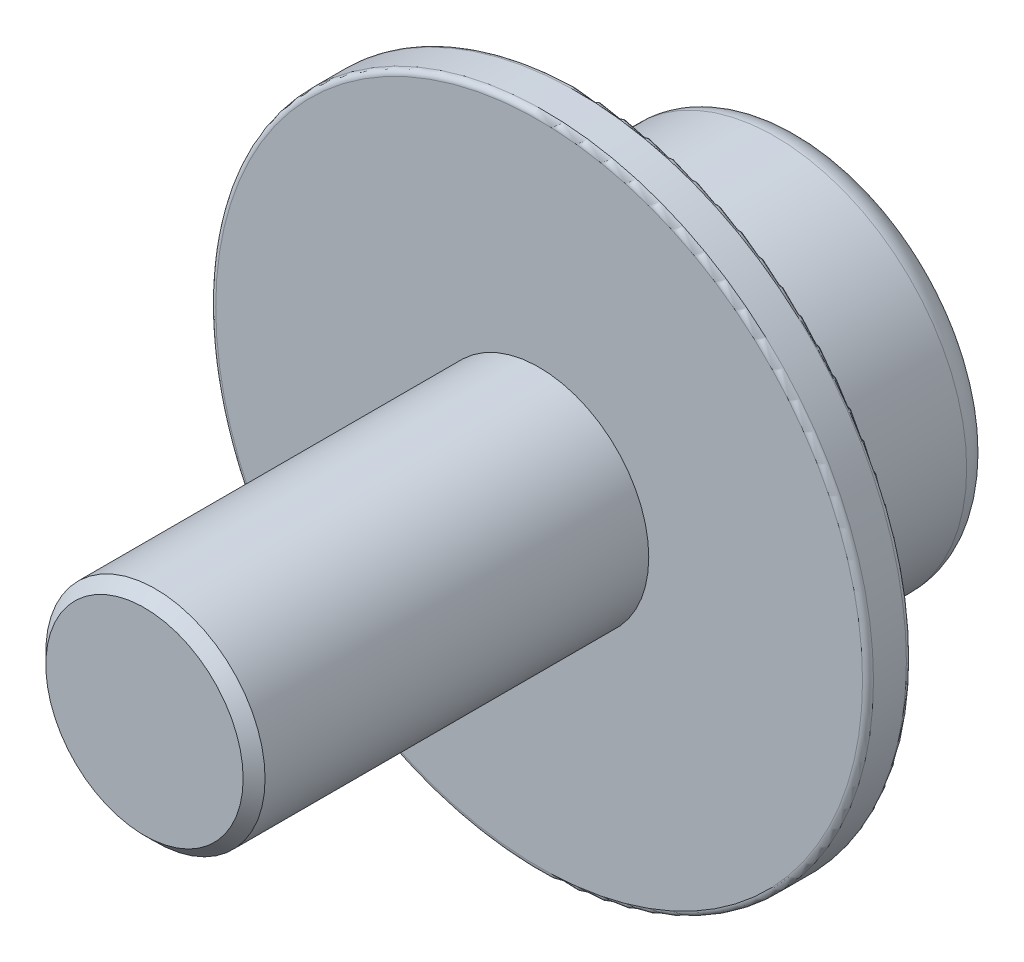
ISO-10303-21;
HEADER;
FILE_DESCRIPTION(('STEP AP214'),'2;1');
FILE_NAME('part.step','',(''),(''),'','','');
FILE_SCHEMA(('AUTOMOTIVE_DESIGN { 1 0 10303 214 1 1 1 1 }'));
ENDSEC;
DATA;
#1=APPLICATION_CONTEXT('core data for automotive mechanical design processes');
#2=APPLICATION_PROTOCOL_DEFINITION('international standard','automotive_design',2000,#1);
#3=PRODUCT_CONTEXT('',#1,'mechanical');
#4=PRODUCT('Part','Part','',(#3));
#5=PRODUCT_RELATED_PRODUCT_CATEGORY('part','',(#4));
#6=PRODUCT_DEFINITION_FORMATION('','',#4);
#7=PRODUCT_DEFINITION_CONTEXT('part definition',#1,'design');
#8=PRODUCT_DEFINITION('design','',#6,#7);
#9=PRODUCT_DEFINITION_SHAPE('','',#8);
#10=(LENGTH_UNIT() NAMED_UNIT(*) SI_UNIT(.MILLI.,.METRE.));
#11=(NAMED_UNIT(*) PLANE_ANGLE_UNIT() SI_UNIT($,.RADIAN.));
#12=(NAMED_UNIT(*) SI_UNIT($,.STERADIAN.) SOLID_ANGLE_UNIT());
#13=UNCERTAINTY_MEASURE_WITH_UNIT(LENGTH_MEASURE(1.E-05),#10,'distance_accuracy_value','');
#14=(GEOMETRIC_REPRESENTATION_CONTEXT(3) GLOBAL_UNCERTAINTY_ASSIGNED_CONTEXT((#13)) GLOBAL_UNIT_ASSIGNED_CONTEXT((#10,
#11,#12)) REPRESENTATION_CONTEXT('',''));
#15=CARTESIAN_POINT('',(0.,0.,0.));
#16=DIRECTION('',(0.,0.,1.));
#17=DIRECTION('',(1.,0.,0.));
#18=AXIS2_PLACEMENT_3D('',#15,#16,#17);
#19=CARTESIAN_POINT('',(0.,0.,4.));
#20=DIRECTION('',(0.,0.,-1.));
#21=DIRECTION('',(-1.,0.,0.));
#22=AXIS2_PLACEMENT_3D('',#19,#20,#21);
#23=CYLINDRICAL_SURFACE('',#22,3.5);
#24=CARTESIAN_POINT('',(0.,0.,3.5));
#25=DIRECTION('',(0.,0.,1.));
#26=DIRECTION('',(1.,0.,0.));
#27=AXIS2_PLACEMENT_3D('',#24,#25,#26);
#28=CIRCLE('',#27,3.5);
#29=CARTESIAN_POINT('',(3.5,0.,3.5));
#30=VERTEX_POINT('',#29);
#31=EDGE_CURVE('E180',#30,#30,#28,.F.);
#32=ORIENTED_EDGE('',*,*,#31,.T.);
#33=EDGE_LOOP('',(#32));
#34=FACE_BOUND('',#33,.T.);
#35=CARTESIAN_POINT('',(0.,0.,0.5));
#36=DIRECTION('',(0.,0.,1.));
#37=DIRECTION('',(1.,0.,0.));
#38=AXIS2_PLACEMENT_3D('',#35,#36,#37);
#39=CIRCLE('',#38,3.5);
#40=CARTESIAN_POINT('',(3.5,0.,0.5));
#41=VERTEX_POINT('',#40);
#42=EDGE_CURVE('E176',#41,#41,#39,.T.);
#43=ORIENTED_EDGE('',*,*,#42,.T.);
#44=EDGE_LOOP('',(#43));
#45=FACE_BOUND('',#44,.T.);
#46=ADVANCED_FACE('F41',(#34,#45),#23,.T.);
#47=CARTESIAN_POINT('',(0.,0.,0.));
#48=DIRECTION('',(0.,0.,1.));
#49=DIRECTION('',(1.,0.,0.));
#50=AXIS2_PLACEMENT_3D('',#47,#48,#49);
#51=PLANE('',#50);
#52=CARTESIAN_POINT('',(0.,0.,0.));
#53=DIRECTION('',(0.,0.,1.));
#54=DIRECTION('',(1.,0.,0.));
#55=AXIS2_PLACEMENT_3D('',#52,#53,#54);
#56=CIRCLE('',#55,3.);
#57=CARTESIAN_POINT('',(3.,0.,0.));
#58=VERTEX_POINT('',#57);
#59=EDGE_CURVE('E203',#58,#58,#56,.F.);
#60=ORIENTED_EDGE('',*,*,#59,.T.);
#61=EDGE_LOOP('',(#60));
#62=FACE_BOUND('',#61,.T.);
#63=DIRECTION('',(0.5,-0.866025403784439,0.));
#64=VECTOR('',#63,1.);
#65=CARTESIAN_POINT('',(1.94855715851499,1.125,0.));
#66=LINE('',#65,#64);
#67=CARTESIAN_POINT('',(2.59807621135332,0.,0.));
#68=VERTEX_POINT('',#67);
#69=CARTESIAN_POINT('',(1.29903810567666,2.25,0.));
#70=VERTEX_POINT('',#69);
#71=EDGE_CURVE('E196',#68,#70,#66,.F.);
#72=ORIENTED_EDGE('',*,*,#71,.T.);
#73=DIRECTION('',(1.,0.,0.));
#74=VECTOR('',#73,1.);
#75=CARTESIAN_POINT('',(0.,2.25,0.));
#76=LINE('',#75,#74);
#77=CARTESIAN_POINT('',(-1.29903810567666,2.25,0.));
#78=VERTEX_POINT('',#77);
#79=EDGE_CURVE('E199',#70,#78,#76,.F.);
#80=ORIENTED_EDGE('',*,*,#79,.T.);
#81=DIRECTION('',(0.5,0.866025403784439,0.));
#82=VECTOR('',#81,1.);
#83=CARTESIAN_POINT('',(-1.94855715851499,1.125,0.));
#84=LINE('',#83,#82);
#85=CARTESIAN_POINT('',(-2.59807621135332,0.,0.));
#86=VERTEX_POINT('',#85);
#87=EDGE_CURVE('E184',#78,#86,#84,.F.);
#88=ORIENTED_EDGE('',*,*,#87,.T.);
#89=DIRECTION('',(-0.5,0.866025403784439,0.));
#90=VECTOR('',#89,1.);
#91=CARTESIAN_POINT('',(-1.94855715851499,-1.125,0.));
#92=LINE('',#91,#90);
#93=CARTESIAN_POINT('',(-1.29903810567666,-2.25,0.));
#94=VERTEX_POINT('',#93);
#95=EDGE_CURVE('E187',#86,#94,#92,.F.);
#96=ORIENTED_EDGE('',*,*,#95,.T.);
#97=DIRECTION('',(-1.,0.,0.));
#98=VECTOR('',#97,1.);
#99=CARTESIAN_POINT('',(0.,-2.25,0.));
#100=LINE('',#99,#98);
#101=CARTESIAN_POINT('',(1.29903810567666,-2.25,0.));
#102=VERTEX_POINT('',#101);
#103=EDGE_CURVE('E190',#94,#102,#100,.F.);
#104=ORIENTED_EDGE('',*,*,#103,.T.);
#105=DIRECTION('',(-0.5,-0.866025403784439,0.));
#106=VECTOR('',#105,1.);
#107=CARTESIAN_POINT('',(1.94855715851499,-1.125,0.));
#108=LINE('',#107,#106);
#109=EDGE_CURVE('E193',#102,#68,#108,.F.);
#110=ORIENTED_EDGE('',*,*,#109,.T.);
#111=EDGE_LOOP('',(#72,#80,#88,#96,#104,#110));
#112=FACE_BOUND('',#111,.T.);
#113=ADVANCED_FACE('F301',(#62,#112),#51,.F.);
#114=CARTESIAN_POINT('',(-1.01036297108185,-1.75,2.5));
#115=DIRECTION('',(-0.866025403784439,-0.5,0.));
#116=DIRECTION('',(0.5,-0.866025403784439,0.));
#117=AXIS2_PLACEMENT_3D('',#114,#115,#116);
#118=PLANE('',#117);
#119=DIRECTION('',(0.,0.,-1.));
#120=VECTOR('',#119,1.);
#121=CARTESIAN_POINT('',(-1.01036297108185,-1.75,2.5));
#122=LINE('',#121,#120);
#123=CARTESIAN_POINT('',(-1.01036297108185,-1.75,2.5));
#124=VERTEX_POINT('',#123);
#125=CARTESIAN_POINT('',(-1.01036297108185,-1.75,0.5));
#126=VERTEX_POINT('',#125);
#127=EDGE_CURVE('E156',#124,#126,#122,.T.);
#128=ORIENTED_EDGE('',*,*,#127,.T.);
#129=DIRECTION('',(-0.5,0.866025403784439,0.));
#130=VECTOR('',#129,1.);
#131=CARTESIAN_POINT('',(-1.01036297108185,-1.75,0.5));
#132=LINE('',#131,#130);
#133=CARTESIAN_POINT('',(-2.02072594216369,0.,0.5));
#134=VERTEX_POINT('',#133);
#135=EDGE_CURVE('E57',#126,#134,#132,.T.);
#136=ORIENTED_EDGE('',*,*,#135,.T.);
#137=DIRECTION('',(0.,0.,-1.));
#138=VECTOR('',#137,1.);
#139=CARTESIAN_POINT('',(-2.02072594216369,0.,2.5));
#140=LINE('',#139,#138);
#141=CARTESIAN_POINT('',(-2.02072594216369,0.,2.5));
#142=VERTEX_POINT('',#141);
#143=EDGE_CURVE('E112',#142,#134,#140,.T.);
#144=ORIENTED_EDGE('',*,*,#143,.F.);
#145=DIRECTION('',(-0.5,0.866025403784439,0.));
#146=VECTOR('',#145,1.);
#147=CARTESIAN_POINT('',(-1.01036297108185,-1.75,2.5));
#148=LINE('',#147,#146);
#149=EDGE_CURVE('E116',#124,#142,#148,.T.);
#150=ORIENTED_EDGE('',*,*,#149,.F.);
#151=EDGE_LOOP('',(#128,#136,#144,#150));
#152=FACE_BOUND('',#151,.T.);
#153=ADVANCED_FACE('F114',(#152),#118,.F.);
#154=CARTESIAN_POINT('',(1.01036297108185,-1.75,2.5));
#155=DIRECTION('',(0.,-1.,0.));
#156=DIRECTION('',(0.,0.,-1.));
#157=AXIS2_PLACEMENT_3D('',#154,#155,#156);
#158=PLANE('',#157);
#159=DIRECTION('',(0.,0.,-1.));
#160=VECTOR('',#159,1.);
#161=CARTESIAN_POINT('',(1.01036297108185,-1.75,2.5));
#162=LINE('',#161,#160);
#163=CARTESIAN_POINT('',(1.01036297108185,-1.75,2.5));
#164=VERTEX_POINT('',#163);
#165=CARTESIAN_POINT('',(1.01036297108185,-1.75,0.5));
#166=VERTEX_POINT('',#165);
#167=EDGE_CURVE('E160',#164,#166,#162,.T.);
#168=ORIENTED_EDGE('',*,*,#167,.T.);
#169=DIRECTION('',(-1.,0.,0.));
#170=VECTOR('',#169,1.);
#171=CARTESIAN_POINT('',(1.01036297108185,-1.75,0.5));
#172=LINE('',#171,#170);
#173=EDGE_CURVE('E65',#166,#126,#172,.T.);
#174=ORIENTED_EDGE('',*,*,#173,.T.);
#175=ORIENTED_EDGE('',*,*,#127,.F.);
#176=DIRECTION('',(-1.,0.,0.));
#177=VECTOR('',#176,1.);
#178=CARTESIAN_POINT('',(1.01036297108185,-1.75,2.5));
#179=LINE('',#178,#177);
#180=EDGE_CURVE('E122',#164,#124,#179,.T.);
#181=ORIENTED_EDGE('',*,*,#180,.F.);
#182=EDGE_LOOP('',(#168,#174,#175,#181));
#183=FACE_BOUND('',#182,.T.);
#184=ADVANCED_FACE('F370',(#183),#158,.F.);
#185=CARTESIAN_POINT('',(2.02072594216369,0.,2.5));
#186=DIRECTION('',(0.866025403784439,-0.5,0.));
#187=DIRECTION('',(0.5,0.866025403784439,0.));
#188=AXIS2_PLACEMENT_3D('',#185,#186,#187);
#189=PLANE('',#188);
#190=DIRECTION('',(0.,0.,-1.));
#191=VECTOR('',#190,1.);
#192=CARTESIAN_POINT('',(2.02072594216369,0.,2.5));
#193=LINE('',#192,#191);
#194=CARTESIAN_POINT('',(2.02072594216369,0.,2.5));
#195=VERTEX_POINT('',#194);
#196=CARTESIAN_POINT('',(2.02072594216369,0.,0.5));
#197=VERTEX_POINT('',#196);
#198=EDGE_CURVE('E163',#195,#197,#193,.T.);
#199=ORIENTED_EDGE('',*,*,#198,.T.);
#200=DIRECTION('',(-0.5,-0.866025403784439,0.));
#201=VECTOR('',#200,1.);
#202=CARTESIAN_POINT('',(2.02072594216369,0.,0.5));
#203=LINE('',#202,#201);
#204=EDGE_CURVE('E214',#197,#166,#203,.T.);
#205=ORIENTED_EDGE('',*,*,#204,.T.);
#206=ORIENTED_EDGE('',*,*,#167,.F.);
#207=DIRECTION('',(-0.5,-0.866025403784439,0.));
#208=VECTOR('',#207,1.);
#209=CARTESIAN_POINT('',(2.02072594216369,0.,2.5));
#210=LINE('',#209,#208);
#211=EDGE_CURVE('E151',#195,#164,#210,.T.);
#212=ORIENTED_EDGE('',*,*,#211,.F.);
#213=EDGE_LOOP('',(#199,#205,#206,#212));
#214=FACE_BOUND('',#213,.T.);
#215=ADVANCED_FACE('F369',(#214),#189,.F.);
#216=CARTESIAN_POINT('',(1.01036297108185,1.75,2.5));
#217=DIRECTION('',(0.866025403784439,0.5,0.));
#218=DIRECTION('',(-0.5,0.866025403784439,0.));
#219=AXIS2_PLACEMENT_3D('',#216,#217,#218);
#220=PLANE('',#219);
#221=DIRECTION('',(0.,0.,-1.));
#222=VECTOR('',#221,1.);
#223=CARTESIAN_POINT('',(1.01036297108185,1.75,2.5));
#224=LINE('',#223,#222);
#225=CARTESIAN_POINT('',(1.01036297108185,1.75,2.5));
#226=VERTEX_POINT('',#225);
#227=CARTESIAN_POINT('',(1.01036297108185,1.75,0.5));
#228=VERTEX_POINT('',#227);
#229=EDGE_CURVE('E167',#226,#228,#224,.T.);
#230=ORIENTED_EDGE('',*,*,#229,.T.);
#231=DIRECTION('',(0.5,-0.866025403784439,0.));
#232=VECTOR('',#231,1.);
#233=CARTESIAN_POINT('',(1.01036297108185,1.75,0.5));
#234=LINE('',#233,#232);
#235=EDGE_CURVE('E211',#228,#197,#234,.T.);
#236=ORIENTED_EDGE('',*,*,#235,.T.);
#237=ORIENTED_EDGE('',*,*,#198,.F.);
#238=DIRECTION('',(0.5,-0.866025403784439,0.));
#239=VECTOR('',#238,1.);
#240=CARTESIAN_POINT('',(1.01036297108185,1.75,2.5));
#241=LINE('',#240,#239);
#242=EDGE_CURVE('E147',#226,#195,#241,.T.);
#243=ORIENTED_EDGE('',*,*,#242,.F.);
#244=EDGE_LOOP('',(#230,#236,#237,#243));
#245=FACE_BOUND('',#244,.T.);
#246=ADVANCED_FACE('F366',(#245),#220,.F.);
#247=CARTESIAN_POINT('',(-1.01036297108184,1.75,2.5));
#248=DIRECTION('',(0.,1.,0.));
#249=DIRECTION('',(0.,0.,1.));
#250=AXIS2_PLACEMENT_3D('',#247,#248,#249);
#251=PLANE('',#250);
#252=DIRECTION('',(0.,0.,-1.));
#253=VECTOR('',#252,1.);
#254=CARTESIAN_POINT('',(-1.01036297108184,1.75,2.5));
#255=LINE('',#254,#253);
#256=CARTESIAN_POINT('',(-1.01036297108184,1.75,2.5));
#257=VERTEX_POINT('',#256);
#258=CARTESIAN_POINT('',(-1.01036297108184,1.75,0.5));
#259=VERTEX_POINT('',#258);
#260=EDGE_CURVE('E121',#257,#259,#255,.T.);
#261=ORIENTED_EDGE('',*,*,#260,.T.);
#262=DIRECTION('',(1.,0.,0.));
#263=VECTOR('',#262,1.);
#264=CARTESIAN_POINT('',(-1.01036297108184,1.75,0.5));
#265=LINE('',#264,#263);
#266=EDGE_CURVE('E207',#259,#228,#265,.T.);
#267=ORIENTED_EDGE('',*,*,#266,.T.);
#268=ORIENTED_EDGE('',*,*,#229,.F.);
#269=DIRECTION('',(1.,0.,0.));
#270=VECTOR('',#269,1.);
#271=CARTESIAN_POINT('',(-1.01036297108184,1.75,2.5));
#272=LINE('',#271,#270);
#273=EDGE_CURVE('E132',#257,#226,#272,.T.);
#274=ORIENTED_EDGE('',*,*,#273,.F.);
#275=EDGE_LOOP('',(#261,#267,#268,#274));
#276=FACE_BOUND('',#275,.T.);
#277=ADVANCED_FACE('F362',(#276),#251,.F.);
#278=CARTESIAN_POINT('',(-2.02072594216369,0.,2.5));
#279=DIRECTION('',(-0.866025403784439,0.5,0.));
#280=DIRECTION('',(-0.5,-0.866025403784439,0.));
#281=AXIS2_PLACEMENT_3D('',#278,#279,#280);
#282=PLANE('',#281);
#283=ORIENTED_EDGE('',*,*,#143,.T.);
#284=DIRECTION('',(0.5,0.866025403784439,0.));
#285=VECTOR('',#284,1.);
#286=CARTESIAN_POINT('',(-2.02072594216369,0.,0.5));
#287=LINE('',#286,#285);
#288=EDGE_CURVE('E221',#134,#259,#287,.T.);
#289=ORIENTED_EDGE('',*,*,#288,.T.);
#290=ORIENTED_EDGE('',*,*,#260,.F.);
#291=DIRECTION('',(0.5,0.866025403784439,0.));
#292=VECTOR('',#291,1.);
#293=CARTESIAN_POINT('',(-2.02072594216369,0.,2.5));
#294=LINE('',#293,#292);
#295=EDGE_CURVE('E125',#142,#257,#294,.T.);
#296=ORIENTED_EDGE('',*,*,#295,.F.);
#297=EDGE_LOOP('',(#283,#289,#290,#296));
#298=FACE_BOUND('',#297,.T.);
#299=ADVANCED_FACE('F126',(#298),#282,.F.);
#300=CARTESIAN_POINT('',(0.,0.,2.5));
#301=DIRECTION('',(0.,0.,-1.));
#302=DIRECTION('',(-1.,0.,0.));
#303=AXIS2_PLACEMENT_3D('',#300,#301,#302);
#304=PLANE('',#303);
#305=ORIENTED_EDGE('',*,*,#149,.T.);
#306=ORIENTED_EDGE('',*,*,#295,.T.);
#307=ORIENTED_EDGE('',*,*,#273,.T.);
#308=ORIENTED_EDGE('',*,*,#242,.T.);
#309=ORIENTED_EDGE('',*,*,#211,.T.);
#310=ORIENTED_EDGE('',*,*,#180,.T.);
#311=EDGE_LOOP('',(#305,#306,#307,#308,#309,#310));
#312=FACE_BOUND('',#311,.T.);
#313=ADVANCED_FACE('F134',(#312),#304,.T.);
#314=CARTESIAN_POINT('',(0.,0.,3.5));
#315=DIRECTION('',(0.,0.,1.));
#316=DIRECTION('',(1.,0.,0.));
#317=AXIS2_PLACEMENT_3D('',#314,#315,#316);
#318=TOROIDAL_SURFACE('',#317,3.,0.5);
#319=ORIENTED_EDGE('',*,*,#31,.F.);
#320=EDGE_LOOP('',(#319));
#321=FACE_BOUND('',#320,.T.);
#322=CARTESIAN_POINT('',(0.,0.,4.));
#323=DIRECTION('',(0.,0.,1.));
#324=DIRECTION('',(1.,0.,0.));
#325=AXIS2_PLACEMENT_3D('',#322,#323,#324);
#326=CIRCLE('',#325,3.);
#327=CARTESIAN_POINT('',(3.,0.,4.));
#328=VERTEX_POINT('',#327);
#329=EDGE_CURVE('E159',#328,#328,#326,.T.);
#330=ORIENTED_EDGE('',*,*,#329,.F.);
#331=EDGE_LOOP('',(#330));
#332=FACE_BOUND('',#331,.T.);
#333=ADVANCED_FACE('F311',(#321,#332),#318,.T.);
#334=CARTESIAN_POINT('',(0.,0.,0.5));
#335=DIRECTION('',(0.,0.,1.));
#336=DIRECTION('',(1.,0.,0.));
#337=AXIS2_PLACEMENT_3D('',#334,#335,#336);
#338=TOROIDAL_SURFACE('',#337,3.,0.5);
#339=ORIENTED_EDGE('',*,*,#59,.F.);
#340=EDGE_LOOP('',(#339));
#341=FACE_BOUND('',#340,.T.);
#342=ORIENTED_EDGE('',*,*,#42,.F.);
#343=EDGE_LOOP('',(#342));
#344=FACE_BOUND('',#343,.T.);
#345=ADVANCED_FACE('F314',(#341,#344),#338,.T.);
#346=CARTESIAN_POINT('',(1.01036297108185,-2.25,0.5));
#347=DIRECTION('',(-1.,0.,0.));
#348=DIRECTION('',(0.,0.,1.));
#349=AXIS2_PLACEMENT_3D('',#346,#347,#348);
#350=CYLINDRICAL_SURFACE('',#349,0.5);
#351=CARTESIAN_POINT('',(1.29903810567666,-2.25,0.5));
#352=DIRECTION('',(-0.866025403784439,-0.5,0.));
#353=DIRECTION('',(0.5,-0.866025403784439,0.));
#354=AXIS2_PLACEMENT_3D('',#351,#352,#353);
#355=ELLIPSE('',#354,0.577350269189626,0.5);
#356=EDGE_CURVE('E142',#102,#166,#355,.F.);
#357=ORIENTED_EDGE('',*,*,#356,.F.);
#358=ORIENTED_EDGE('',*,*,#103,.F.);
#359=CARTESIAN_POINT('',(-1.29903810567666,-2.25,0.5));
#360=DIRECTION('',(-0.866025403784438,0.5,0.));
#361=DIRECTION('',(-0.5,-0.866025403784439,0.));
#362=AXIS2_PLACEMENT_3D('',#359,#360,#361);
#363=ELLIPSE('',#362,0.577350269189626,0.5);
#364=EDGE_CURVE('E138',#126,#94,#363,.T.);
#365=ORIENTED_EDGE('',*,*,#364,.F.);
#366=ORIENTED_EDGE('',*,*,#173,.F.);
#367=EDGE_LOOP('',(#357,#358,#365,#366));
#368=FACE_BOUND('',#367,.T.);
#369=ADVANCED_FACE('F318',(#368),#350,.T.);
#370=CARTESIAN_POINT('',(-1.44337567297406,-2.,0.5));
#371=DIRECTION('',(-0.5,0.866025403784439,0.));
#372=DIRECTION('',(-0.866025403784439,-0.5,0.));
#373=AXIS2_PLACEMENT_3D('',#370,#371,#372);
#374=CYLINDRICAL_SURFACE('',#373,0.5);
#375=ORIENTED_EDGE('',*,*,#364,.T.);
#376=ORIENTED_EDGE('',*,*,#95,.F.);
#377=CARTESIAN_POINT('',(-2.59807621135332,0.,0.5));
#378=DIRECTION('',(0.,1.,0.));
#379=DIRECTION('',(-1.,0.,0.));
#380=AXIS2_PLACEMENT_3D('',#377,#378,#379);
#381=ELLIPSE('',#380,0.577350269189626,0.5);
#382=EDGE_CURVE('E236',#134,#86,#381,.T.);
#383=ORIENTED_EDGE('',*,*,#382,.F.);
#384=ORIENTED_EDGE('',*,*,#135,.F.);
#385=EDGE_LOOP('',(#375,#376,#383,#384));
#386=FACE_BOUND('',#385,.T.);
#387=ADVANCED_FACE('F335',(#386),#374,.T.);
#388=CARTESIAN_POINT('',(2.45373864405591,-0.25,0.5));
#389=DIRECTION('',(-0.5,-0.866025403784439,0.));
#390=DIRECTION('',(0.866025403784439,-0.5,0.));
#391=AXIS2_PLACEMENT_3D('',#388,#389,#390);
#392=CYLINDRICAL_SURFACE('',#391,0.5);
#393=ORIENTED_EDGE('',*,*,#356,.T.);
#394=ORIENTED_EDGE('',*,*,#204,.F.);
#395=CARTESIAN_POINT('',(2.59807621135332,0.,0.5));
#396=DIRECTION('',(0.,-1.,0.));
#397=DIRECTION('',(1.,0.,0.));
#398=AXIS2_PLACEMENT_3D('',#395,#396,#397);
#399=ELLIPSE('',#398,0.577350269189626,0.5);
#400=EDGE_CURVE('E232',#68,#197,#399,.F.);
#401=ORIENTED_EDGE('',*,*,#400,.F.);
#402=ORIENTED_EDGE('',*,*,#109,.F.);
#403=EDGE_LOOP('',(#393,#394,#401,#402));
#404=FACE_BOUND('',#403,.T.);
#405=ADVANCED_FACE('F331',(#404),#392,.T.);
#406=CARTESIAN_POINT('',(-2.45373864405591,0.250000000000001,0.5));
#407=DIRECTION('',(0.5,0.866025403784439,0.));
#408=DIRECTION('',(-0.866025403784439,0.5,0.));
#409=AXIS2_PLACEMENT_3D('',#406,#407,#408);
#410=CYLINDRICAL_SURFACE('',#409,0.5);
#411=ORIENTED_EDGE('',*,*,#382,.T.);
#412=ORIENTED_EDGE('',*,*,#87,.F.);
#413=CARTESIAN_POINT('',(-1.29903810567666,2.25,0.5));
#414=DIRECTION('',(0.866025403784439,0.5,0.));
#415=DIRECTION('',(0.5,-0.866025403784439,0.));
#416=AXIS2_PLACEMENT_3D('',#413,#414,#415);
#417=ELLIPSE('',#416,0.577350269189626,0.5);
#418=EDGE_CURVE('E228',#259,#78,#417,.T.);
#419=ORIENTED_EDGE('',*,*,#418,.F.);
#420=ORIENTED_EDGE('',*,*,#288,.F.);
#421=EDGE_LOOP('',(#411,#412,#419,#420));
#422=FACE_BOUND('',#421,.T.);
#423=ADVANCED_FACE('F327',(#422),#410,.T.);
#424=CARTESIAN_POINT('',(1.44337567297406,2.,0.5));
#425=DIRECTION('',(0.5,-0.866025403784439,0.));
#426=DIRECTION('',(0.866025403784439,0.5,0.));
#427=AXIS2_PLACEMENT_3D('',#424,#425,#426);
#428=CYLINDRICAL_SURFACE('',#427,0.5);
#429=ORIENTED_EDGE('',*,*,#400,.T.);
#430=ORIENTED_EDGE('',*,*,#235,.F.);
#431=CARTESIAN_POINT('',(1.29903810567666,2.25,0.5));
#432=DIRECTION('',(0.866025403784439,-0.5,0.));
#433=DIRECTION('',(0.5,0.866025403784439,0.));
#434=AXIS2_PLACEMENT_3D('',#431,#432,#433);
#435=ELLIPSE('',#434,0.577350269189626,0.5);
#436=EDGE_CURVE('E225',#70,#228,#435,.F.);
#437=ORIENTED_EDGE('',*,*,#436,.F.);
#438=ORIENTED_EDGE('',*,*,#71,.F.);
#439=EDGE_LOOP('',(#429,#430,#437,#438));
#440=FACE_BOUND('',#439,.T.);
#441=ADVANCED_FACE('F323',(#440),#428,.T.);
#442=CARTESIAN_POINT('',(-1.01036297108184,2.25,0.5));
#443=DIRECTION('',(1.,0.,0.));
#444=DIRECTION('',(0.,0.,-1.));
#445=AXIS2_PLACEMENT_3D('',#442,#443,#444);
#446=CYLINDRICAL_SURFACE('',#445,0.5);
#447=ORIENTED_EDGE('',*,*,#418,.T.);
#448=ORIENTED_EDGE('',*,*,#79,.F.);
#449=ORIENTED_EDGE('',*,*,#436,.T.);
#450=ORIENTED_EDGE('',*,*,#266,.F.);
#451=EDGE_LOOP('',(#447,#448,#449,#450));
#452=FACE_BOUND('',#451,.T.);
#453=ADVANCED_FACE('F320',(#452),#446,.T.);
#454=CARTESIAN_POINT('',(0.,0.,4.8));
#455=DIRECTION('',(0.,0.,-1.));
#456=DIRECTION('',(-1.,0.,0.));
#457=AXIS2_PLACEMENT_3D('',#454,#455,#456);
#458=CYLINDRICAL_SURFACE('',#457,6.);
#459=CARTESIAN_POINT('',(0.,0.,4.7));
#460=DIRECTION('',(0.,0.,1.));
#461=DIRECTION('',(1.,0.,0.));
#462=AXIS2_PLACEMENT_3D('',#459,#460,#461);
#463=CIRCLE('',#462,6.);
#464=CARTESIAN_POINT('',(6.,0.,4.7));
#465=VERTEX_POINT('',#464);
#466=EDGE_CURVE('E50',#465,#465,#463,.F.);
#467=ORIENTED_EDGE('',*,*,#466,.T.);
#468=EDGE_LOOP('',(#467));
#469=FACE_BOUND('',#468,.T.);
#470=CARTESIAN_POINT('',(0.,0.,4.1));
#471=DIRECTION('',(0.,0.,1.));
#472=DIRECTION('',(1.,0.,0.));
#473=AXIS2_PLACEMENT_3D('',#470,#471,#472);
#474=CIRCLE('',#473,6.);
#475=CARTESIAN_POINT('',(6.,0.,4.1));
#476=VERTEX_POINT('',#475);
#477=EDGE_CURVE('E257',#476,#476,#474,.T.);
#478=ORIENTED_EDGE('',*,*,#477,.T.);
#479=EDGE_LOOP('',(#478));
#480=FACE_BOUND('',#479,.T.);
#481=ADVANCED_FACE('F264',(#469,#480),#458,.T.);
#482=CARTESIAN_POINT('',(0.,0.,4.8));
#483=DIRECTION('',(0.,0.,1.));
#484=DIRECTION('',(1.,0.,0.));
#485=AXIS2_PLACEMENT_3D('',#482,#483,#484);
#486=PLANE('',#485);
#487=CARTESIAN_POINT('',(0.,0.,4.8));
#488=DIRECTION('',(0.,0.,1.));
#489=DIRECTION('',(1.,0.,0.));
#490=AXIS2_PLACEMENT_3D('',#487,#488,#489);
#491=CIRCLE('',#490,5.9);
#492=CARTESIAN_POINT('',(5.9,0.,4.8));
#493=VERTEX_POINT('',#492);
#494=EDGE_CURVE('E250',#493,#493,#491,.T.);
#495=ORIENTED_EDGE('',*,*,#494,.T.);
#496=EDGE_LOOP('',(#495));
#497=FACE_BOUND('',#496,.T.);
#498=CARTESIAN_POINT('',(0.,0.,4.8));
#499=DIRECTION('',(0.,0.,1.));
#500=DIRECTION('',(1.,0.,0.));
#501=AXIS2_PLACEMENT_3D('',#498,#499,#500);
#502=CIRCLE('',#501,2.);
#503=CARTESIAN_POINT('',(2.,0.,4.8));
#504=VERTEX_POINT('',#503);
#505=EDGE_CURVE('E229',#504,#504,#502,.T.);
#506=ORIENTED_EDGE('',*,*,#505,.F.);
#507=EDGE_LOOP('',(#506));
#508=FACE_BOUND('',#507,.T.);
#509=ADVANCED_FACE('F273',(#497,#508),#486,.T.);
#510=CARTESIAN_POINT('',(0.,0.,4.));
#511=DIRECTION('',(0.,0.,1.));
#512=DIRECTION('',(1.,0.,0.));
#513=AXIS2_PLACEMENT_3D('',#510,#511,#512);
#514=PLANE('',#513);
#515=CARTESIAN_POINT('',(0.,0.,4.));
#516=DIRECTION('',(0.,0.,1.));
#517=DIRECTION('',(1.,0.,0.));
#518=AXIS2_PLACEMENT_3D('',#515,#516,#517);
#519=CIRCLE('',#518,5.9);
#520=CARTESIAN_POINT('',(5.9,0.,4.));
#521=VERTEX_POINT('',#520);
#522=EDGE_CURVE('E11',#521,#521,#519,.F.);
#523=ORIENTED_EDGE('',*,*,#522,.T.);
#524=EDGE_LOOP('',(#523));
#525=FACE_BOUND('',#524,.T.);
#526=ORIENTED_EDGE('',*,*,#329,.T.);
#527=EDGE_LOOP('',(#526));
#528=FACE_BOUND('',#527,.T.);
#529=ADVANCED_FACE('F276',(#525,#528),#514,.F.);
#530=CARTESIAN_POINT('',(0.,0.,12.));
#531=DIRECTION('',(0.,0.,1.));
#532=DIRECTION('',(1.,0.,0.));
#533=AXIS2_PLACEMENT_3D('',#530,#531,#532);
#534=PLANE('',#533);
#535=CARTESIAN_POINT('',(0.,0.,12.));
#536=DIRECTION('',(0.,0.,1.));
#537=DIRECTION('',(1.,0.,0.));
#538=AXIS2_PLACEMENT_3D('',#535,#536,#537);
#539=CIRCLE('',#538,1.8);
#540=CARTESIAN_POINT('',(1.8,0.,12.));
#541=VERTEX_POINT('',#540);
#542=EDGE_CURVE('E224',#541,#541,#539,.T.);
#543=ORIENTED_EDGE('',*,*,#542,.T.);
#544=EDGE_LOOP('',(#543));
#545=FACE_BOUND('',#544,.T.);
#546=ADVANCED_FACE('F288',(#545),#534,.T.);
#547=CARTESIAN_POINT('',(0.,0.,12.));
#548=DIRECTION('',(0.,0.,-1.));
#549=DIRECTION('',(-1.,0.,0.));
#550=AXIS2_PLACEMENT_3D('',#547,#548,#549);
#551=CONICAL_SURFACE('',#550,1.8,0.785398163397448);
#552=CARTESIAN_POINT('',(0.,0.,11.8));
#553=DIRECTION('',(0.,0.,1.));
#554=DIRECTION('',(1.,0.,0.));
#555=AXIS2_PLACEMENT_3D('',#552,#553,#554);
#556=CIRCLE('',#555,2.);
#557=CARTESIAN_POINT('',(2.,0.,11.8));
#558=VERTEX_POINT('',#557);
#559=EDGE_CURVE('E246',#558,#558,#556,.F.);
#560=ORIENTED_EDGE('',*,*,#559,.F.);
#561=EDGE_LOOP('',(#560));
#562=FACE_BOUND('',#561,.T.);
#563=ORIENTED_EDGE('',*,*,#542,.F.);
#564=EDGE_LOOP('',(#563));
#565=FACE_BOUND('',#564,.T.);
#566=ADVANCED_FACE('F282',(#562,#565),#551,.T.);
#567=CARTESIAN_POINT('',(0.,0.,12.));
#568=DIRECTION('',(0.,0.,-1.));
#569=DIRECTION('',(-1.,0.,0.));
#570=AXIS2_PLACEMENT_3D('',#567,#568,#569);
#571=CYLINDRICAL_SURFACE('',#570,2.);
#572=ORIENTED_EDGE('',*,*,#505,.T.);
#573=EDGE_LOOP('',(#572));
#574=FACE_BOUND('',#573,.T.);
#575=ORIENTED_EDGE('',*,*,#559,.T.);
#576=EDGE_LOOP('',(#575));
#577=FACE_BOUND('',#576,.T.);
#578=ADVANCED_FACE('F270',(#574,#577),#571,.T.);
#579=CARTESIAN_POINT('',(0.,0.,4.7));
#580=DIRECTION('',(0.,0.,1.));
#581=DIRECTION('',(1.,0.,0.));
#582=AXIS2_PLACEMENT_3D('',#579,#580,#581);
#583=TOROIDAL_SURFACE('',#582,5.9,0.1);
#584=ORIENTED_EDGE('',*,*,#466,.F.);
#585=EDGE_LOOP('',(#584));
#586=FACE_BOUND('',#585,.T.);
#587=ORIENTED_EDGE('',*,*,#494,.F.);
#588=EDGE_LOOP('',(#587));
#589=FACE_BOUND('',#588,.T.);
#590=ADVANCED_FACE('F267',(#586,#589),#583,.T.);
#591=CARTESIAN_POINT('',(0.,0.,4.1));
#592=DIRECTION('',(0.,0.,1.));
#593=DIRECTION('',(1.,0.,0.));
#594=AXIS2_PLACEMENT_3D('',#591,#592,#593);
#595=TOROIDAL_SURFACE('',#594,5.9,0.1);
#596=ORIENTED_EDGE('',*,*,#522,.F.);
#597=EDGE_LOOP('',(#596));
#598=FACE_BOUND('',#597,.T.);
#599=ORIENTED_EDGE('',*,*,#477,.F.);
#600=EDGE_LOOP('',(#599));
#601=FACE_BOUND('',#600,.T.);
#602=ADVANCED_FACE('F43',(#598,#601),#595,.T.);
#603=CLOSED_SHELL('',(#46,#113,#153,#184,#215,#246,#277,#299,#313,#333,#345,#369,#387,#405,#423,
#441,#453,#481,#509,#529,#546,#566,#578,#590,#602));
#604=MANIFOLD_SOLID_BREP('B2',#603);
#605=ADVANCED_BREP_SHAPE_REPRESENTATION('',(#18,#604),#14);
#606=SHAPE_DEFINITION_REPRESENTATION(#9,#605);
ENDSEC;
END-ISO-10303-21;
